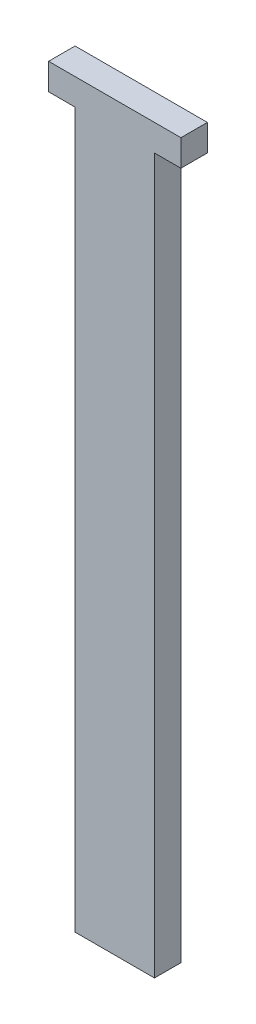
ISO-10303-21;
HEADER;
FILE_DESCRIPTION(('STEP AP214'),'2;1');
FILE_NAME('part.step','',(''),(''),'','','');
FILE_SCHEMA(('AUTOMOTIVE_DESIGN { 1 0 10303 214 1 1 1 1 }'));
ENDSEC;
DATA;
#1=APPLICATION_CONTEXT('core data for automotive mechanical design processes');
#2=APPLICATION_PROTOCOL_DEFINITION('international standard','automotive_design',2000,#1);
#3=PRODUCT_CONTEXT('',#1,'mechanical');
#4=PRODUCT('Part','Part','',(#3));
#5=PRODUCT_RELATED_PRODUCT_CATEGORY('part','',(#4));
#6=PRODUCT_DEFINITION_FORMATION('','',#4);
#7=PRODUCT_DEFINITION_CONTEXT('part definition',#1,'design');
#8=PRODUCT_DEFINITION('design','',#6,#7);
#9=PRODUCT_DEFINITION_SHAPE('','',#8);
#10=(LENGTH_UNIT() NAMED_UNIT(*) SI_UNIT(.MILLI.,.METRE.));
#11=(NAMED_UNIT(*) PLANE_ANGLE_UNIT() SI_UNIT($,.RADIAN.));
#12=(NAMED_UNIT(*) SI_UNIT($,.STERADIAN.) SOLID_ANGLE_UNIT());
#13=UNCERTAINTY_MEASURE_WITH_UNIT(LENGTH_MEASURE(1.E-05),#10,'distance_accuracy_value','');
#14=(GEOMETRIC_REPRESENTATION_CONTEXT(3) GLOBAL_UNCERTAINTY_ASSIGNED_CONTEXT((#13)) GLOBAL_UNIT_ASSIGNED_CONTEXT((#10,
#11,#12)) REPRESENTATION_CONTEXT('',''));
#15=CARTESIAN_POINT('',(0.,0.,0.));
#16=DIRECTION('',(0.,0.,1.));
#17=DIRECTION('',(1.,0.,0.));
#18=AXIS2_PLACEMENT_3D('',#15,#16,#17);
#19=CARTESIAN_POINT('',(-32.5192307692308,47.7884615384615,5.));
#20=DIRECTION('',(0.,1.,0.));
#21=DIRECTION('',(0.,0.,1.));
#22=AXIS2_PLACEMENT_3D('',#19,#20,#21);
#23=PLANE('',#22);
#24=DIRECTION('',(1.,0.,0.));
#25=VECTOR('',#24,1.);
#26=CARTESIAN_POINT('',(-32.5192307692308,47.7884615384615,0.));
#27=LINE('',#26,#25);
#28=CARTESIAN_POINT('',(-32.5192307692308,47.7884615384615,0.));
#29=VERTEX_POINT('',#28);
#30=CARTESIAN_POINT('',(-27.5192307692308,47.7884615384615,0.));
#31=VERTEX_POINT('',#30);
#32=EDGE_CURVE('E131',#29,#31,#27,.T.);
#33=ORIENTED_EDGE('',*,*,#32,.T.);
#34=DIRECTION('',(0.,0.,-1.));
#35=VECTOR('',#34,1.);
#36=CARTESIAN_POINT('',(-27.5192307692308,47.7884615384615,5.));
#37=LINE('',#36,#35);
#38=CARTESIAN_POINT('',(-27.5192307692308,47.7884615384615,5.));
#39=VERTEX_POINT('',#38);
#40=EDGE_CURVE('E11',#39,#31,#37,.T.);
#41=ORIENTED_EDGE('',*,*,#40,.F.);
#42=DIRECTION('',(1.,0.,0.));
#43=VECTOR('',#42,1.);
#44=CARTESIAN_POINT('',(-32.5192307692308,47.7884615384615,5.));
#45=LINE('',#44,#43);
#46=CARTESIAN_POINT('',(-32.5192307692308,47.7884615384615,5.));
#47=VERTEX_POINT('',#46);
#48=EDGE_CURVE('E145',#47,#39,#45,.T.);
#49=ORIENTED_EDGE('',*,*,#48,.F.);
#50=DIRECTION('',(0.,0.,-1.));
#51=VECTOR('',#50,1.);
#52=CARTESIAN_POINT('',(-32.5192307692308,47.7884615384615,5.));
#53=LINE('',#52,#51);
#54=EDGE_CURVE('E127',#47,#29,#53,.T.);
#55=ORIENTED_EDGE('',*,*,#54,.T.);
#56=EDGE_LOOP('',(#33,#41,#49,#55));
#57=FACE_BOUND('',#56,.T.);
#58=ADVANCED_FACE('F35',(#57),#23,.F.);
#59=CARTESIAN_POINT('',(-27.5192307692308,47.7884615384615,5.));
#60=DIRECTION('',(1.,0.,0.));
#61=DIRECTION('',(0.,1.,0.));
#62=AXIS2_PLACEMENT_3D('',#59,#60,#61);
#63=PLANE('',#62);
#64=DIRECTION('',(0.,-1.,0.));
#65=VECTOR('',#64,1.);
#66=CARTESIAN_POINT('',(-27.5192307692308,47.7884615384615,0.));
#67=LINE('',#66,#65);
#68=CARTESIAN_POINT('',(-27.5192307692307,-87.2115384615385,0.));
#69=VERTEX_POINT('',#68);
#70=EDGE_CURVE('E134',#31,#69,#67,.T.);
#71=ORIENTED_EDGE('',*,*,#70,.T.);
#72=DIRECTION('',(0.,0.,-1.));
#73=VECTOR('',#72,1.);
#74=CARTESIAN_POINT('',(-27.5192307692307,-87.2115384615385,5.));
#75=LINE('',#74,#73);
#76=CARTESIAN_POINT('',(-27.5192307692307,-87.2115384615385,5.));
#77=VERTEX_POINT('',#76);
#78=EDGE_CURVE('E43',#77,#69,#75,.T.);
#79=ORIENTED_EDGE('',*,*,#78,.F.);
#80=DIRECTION('',(0.,-1.,0.));
#81=VECTOR('',#80,1.);
#82=CARTESIAN_POINT('',(-27.5192307692308,47.7884615384615,5.));
#83=LINE('',#82,#81);
#84=EDGE_CURVE('E94',#39,#77,#83,.T.);
#85=ORIENTED_EDGE('',*,*,#84,.F.);
#86=ORIENTED_EDGE('',*,*,#40,.T.);
#87=EDGE_LOOP('',(#71,#79,#85,#86));
#88=FACE_BOUND('',#87,.T.);
#89=ADVANCED_FACE('F180',(#88),#63,.F.);
#90=CARTESIAN_POINT('',(-27.5192307692307,-87.2115384615385,5.));
#91=DIRECTION('',(0.,1.,0.));
#92=DIRECTION('',(0.,0.,1.));
#93=AXIS2_PLACEMENT_3D('',#90,#91,#92);
#94=PLANE('',#93);
#95=DIRECTION('',(1.,0.,0.));
#96=VECTOR('',#95,1.);
#97=CARTESIAN_POINT('',(-27.5192307692307,-87.2115384615385,0.));
#98=LINE('',#97,#96);
#99=CARTESIAN_POINT('',(-12.5192307692308,-87.2115384615385,0.));
#100=VERTEX_POINT('',#99);
#101=EDGE_CURVE('E136',#69,#100,#98,.T.);
#102=ORIENTED_EDGE('',*,*,#101,.T.);
#103=DIRECTION('',(0.,0.,-1.));
#104=VECTOR('',#103,1.);
#105=CARTESIAN_POINT('',(-12.5192307692308,-87.2115384615385,5.));
#106=LINE('',#105,#104);
#107=CARTESIAN_POINT('',(-12.5192307692308,-87.2115384615385,5.));
#108=VERTEX_POINT('',#107);
#109=EDGE_CURVE('E152',#108,#100,#106,.T.);
#110=ORIENTED_EDGE('',*,*,#109,.F.);
#111=DIRECTION('',(1.,0.,0.));
#112=VECTOR('',#111,1.);
#113=CARTESIAN_POINT('',(-27.5192307692307,-87.2115384615385,5.));
#114=LINE('',#113,#112);
#115=EDGE_CURVE('E160',#77,#108,#114,.T.);
#116=ORIENTED_EDGE('',*,*,#115,.F.);
#117=ORIENTED_EDGE('',*,*,#78,.T.);
#118=EDGE_LOOP('',(#102,#110,#116,#117));
#119=FACE_BOUND('',#118,.T.);
#120=ADVANCED_FACE('F158',(#119),#94,.F.);
#121=CARTESIAN_POINT('',(-12.5192307692307,47.7884615384615,5.));
#122=DIRECTION('',(-1.,0.,0.));
#123=DIRECTION('',(0.,-1.,0.));
#124=AXIS2_PLACEMENT_3D('',#121,#122,#123);
#125=PLANE('',#124);
#126=DIRECTION('',(0.,1.,0.));
#127=VECTOR('',#126,1.);
#128=CARTESIAN_POINT('',(-12.5192307692307,47.7884615384615,0.));
#129=LINE('',#128,#127);
#130=CARTESIAN_POINT('',(-12.5192307692307,47.7884615384615,0.));
#131=VERTEX_POINT('',#130);
#132=EDGE_CURVE('E138',#100,#131,#129,.T.);
#133=ORIENTED_EDGE('',*,*,#132,.T.);
#134=DIRECTION('',(0.,0.,-1.));
#135=VECTOR('',#134,1.);
#136=CARTESIAN_POINT('',(-12.5192307692307,47.7884615384615,5.));
#137=LINE('',#136,#135);
#138=CARTESIAN_POINT('',(-12.5192307692307,47.7884615384615,5.));
#139=VERTEX_POINT('',#138);
#140=EDGE_CURVE('E149',#139,#131,#137,.T.);
#141=ORIENTED_EDGE('',*,*,#140,.F.);
#142=DIRECTION('',(0.,1.,0.));
#143=VECTOR('',#142,1.);
#144=CARTESIAN_POINT('',(-12.5192307692307,47.7884615384615,5.));
#145=LINE('',#144,#143);
#146=EDGE_CURVE('E172',#108,#139,#145,.T.);
#147=ORIENTED_EDGE('',*,*,#146,.F.);
#148=ORIENTED_EDGE('',*,*,#109,.T.);
#149=EDGE_LOOP('',(#133,#141,#147,#148));
#150=FACE_BOUND('',#149,.T.);
#151=ADVANCED_FACE('F168',(#150),#125,.F.);
#152=CARTESIAN_POINT('',(-12.5192307692307,47.7884615384615,5.));
#153=DIRECTION('',(0.,1.,0.));
#154=DIRECTION('',(0.,0.,1.));
#155=AXIS2_PLACEMENT_3D('',#152,#153,#154);
#156=PLANE('',#155);
#157=DIRECTION('',(1.,0.,0.));
#158=VECTOR('',#157,1.);
#159=CARTESIAN_POINT('',(-12.5192307692307,47.7884615384615,0.));
#160=LINE('',#159,#158);
#161=CARTESIAN_POINT('',(-7.51923076923075,47.7884615384615,0.));
#162=VERTEX_POINT('',#161);
#163=EDGE_CURVE('E140',#131,#162,#160,.T.);
#164=ORIENTED_EDGE('',*,*,#163,.T.);
#165=DIRECTION('',(0.,0.,-1.));
#166=VECTOR('',#165,1.);
#167=CARTESIAN_POINT('',(-7.51923076923075,47.7884615384615,5.));
#168=LINE('',#167,#166);
#169=CARTESIAN_POINT('',(-7.51923076923075,47.7884615384615,5.));
#170=VERTEX_POINT('',#169);
#171=EDGE_CURVE('E122',#170,#162,#168,.T.);
#172=ORIENTED_EDGE('',*,*,#171,.F.);
#173=DIRECTION('',(1.,0.,0.));
#174=VECTOR('',#173,1.);
#175=CARTESIAN_POINT('',(-12.5192307692307,47.7884615384615,5.));
#176=LINE('',#175,#174);
#177=EDGE_CURVE('E113',#139,#170,#176,.T.);
#178=ORIENTED_EDGE('',*,*,#177,.F.);
#179=ORIENTED_EDGE('',*,*,#140,.T.);
#180=EDGE_LOOP('',(#164,#172,#178,#179));
#181=FACE_BOUND('',#180,.T.);
#182=ADVANCED_FACE('F171',(#181),#156,.F.);
#183=CARTESIAN_POINT('',(-7.51923076923075,52.7884615384615,5.));
#184=DIRECTION('',(-1.,0.,0.));
#185=DIRECTION('',(0.,-1.,0.));
#186=AXIS2_PLACEMENT_3D('',#183,#184,#185);
#187=PLANE('',#186);
#188=DIRECTION('',(0.,1.,0.));
#189=VECTOR('',#188,1.);
#190=CARTESIAN_POINT('',(-7.51923076923075,52.7884615384615,0.));
#191=LINE('',#190,#189);
#192=CARTESIAN_POINT('',(-7.51923076923075,52.7884615384615,0.));
#193=VERTEX_POINT('',#192);
#194=EDGE_CURVE('E121',#162,#193,#191,.T.);
#195=ORIENTED_EDGE('',*,*,#194,.T.);
#196=DIRECTION('',(0.,0.,-1.));
#197=VECTOR('',#196,1.);
#198=CARTESIAN_POINT('',(-7.51923076923075,52.7884615384615,5.));
#199=LINE('',#198,#197);
#200=CARTESIAN_POINT('',(-7.51923076923075,52.7884615384615,5.));
#201=VERTEX_POINT('',#200);
#202=EDGE_CURVE('E118',#201,#193,#199,.T.);
#203=ORIENTED_EDGE('',*,*,#202,.F.);
#204=DIRECTION('',(0.,1.,0.));
#205=VECTOR('',#204,1.);
#206=CARTESIAN_POINT('',(-7.51923076923075,52.7884615384615,5.));
#207=LINE('',#206,#205);
#208=EDGE_CURVE('E107',#170,#201,#207,.T.);
#209=ORIENTED_EDGE('',*,*,#208,.F.);
#210=ORIENTED_EDGE('',*,*,#171,.T.);
#211=EDGE_LOOP('',(#195,#203,#209,#210));
#212=FACE_BOUND('',#211,.T.);
#213=ADVANCED_FACE('F119',(#212),#187,.F.);
#214=CARTESIAN_POINT('',(-32.5192307692308,52.7884615384615,5.));
#215=DIRECTION('',(0.,-1.,0.));
#216=DIRECTION('',(0.,0.,-1.));
#217=AXIS2_PLACEMENT_3D('',#214,#215,#216);
#218=PLANE('',#217);
#219=DIRECTION('',(-1.,0.,0.));
#220=VECTOR('',#219,1.);
#221=CARTESIAN_POINT('',(-32.5192307692308,52.7884615384615,0.));
#222=LINE('',#221,#220);
#223=CARTESIAN_POINT('',(-32.5192307692308,52.7884615384615,0.));
#224=VERTEX_POINT('',#223);
#225=EDGE_CURVE('E80',#193,#224,#222,.T.);
#226=ORIENTED_EDGE('',*,*,#225,.T.);
#227=DIRECTION('',(0.,0.,-1.));
#228=VECTOR('',#227,1.);
#229=CARTESIAN_POINT('',(-32.5192307692308,52.7884615384615,5.));
#230=LINE('',#229,#228);
#231=CARTESIAN_POINT('',(-32.5192307692308,52.7884615384615,5.));
#232=VERTEX_POINT('',#231);
#233=EDGE_CURVE('E123',#232,#224,#230,.T.);
#234=ORIENTED_EDGE('',*,*,#233,.F.);
#235=DIRECTION('',(-1.,0.,0.));
#236=VECTOR('',#235,1.);
#237=CARTESIAN_POINT('',(-32.5192307692308,52.7884615384615,5.));
#238=LINE('',#237,#236);
#239=EDGE_CURVE('E111',#201,#232,#238,.T.);
#240=ORIENTED_EDGE('',*,*,#239,.F.);
#241=ORIENTED_EDGE('',*,*,#202,.T.);
#242=EDGE_LOOP('',(#226,#234,#240,#241));
#243=FACE_BOUND('',#242,.T.);
#244=ADVANCED_FACE('F125',(#243),#218,.F.);
#245=CARTESIAN_POINT('',(-32.5192307692308,52.7884615384615,5.));
#246=DIRECTION('',(1.,0.,0.));
#247=DIRECTION('',(0.,0.,-1.));
#248=AXIS2_PLACEMENT_3D('',#245,#246,#247);
#249=PLANE('',#248);
#250=DIRECTION('',(0.,-1.,0.));
#251=VECTOR('',#250,1.);
#252=CARTESIAN_POINT('',(-32.5192307692308,52.7884615384615,0.));
#253=LINE('',#252,#251);
#254=EDGE_CURVE('E86',#224,#29,#253,.T.);
#255=ORIENTED_EDGE('',*,*,#254,.T.);
#256=ORIENTED_EDGE('',*,*,#54,.F.);
#257=DIRECTION('',(0.,-1.,0.));
#258=VECTOR('',#257,1.);
#259=CARTESIAN_POINT('',(-32.5192307692308,52.7884615384615,5.));
#260=LINE('',#259,#258);
#261=EDGE_CURVE('E51',#232,#47,#260,.T.);
#262=ORIENTED_EDGE('',*,*,#261,.F.);
#263=ORIENTED_EDGE('',*,*,#233,.T.);
#264=EDGE_LOOP('',(#255,#256,#262,#263));
#265=FACE_BOUND('',#264,.T.);
#266=ADVANCED_FACE('F196',(#265),#249,.F.);
#267=CARTESIAN_POINT('',(0.,0.,5.));
#268=DIRECTION('',(0.,0.,-1.));
#269=DIRECTION('',(-1.,0.,0.));
#270=AXIS2_PLACEMENT_3D('',#267,#268,#269);
#271=PLANE('',#270);
#272=ORIENTED_EDGE('',*,*,#48,.T.);
#273=ORIENTED_EDGE('',*,*,#84,.T.);
#274=ORIENTED_EDGE('',*,*,#115,.T.);
#275=ORIENTED_EDGE('',*,*,#146,.T.);
#276=ORIENTED_EDGE('',*,*,#177,.T.);
#277=ORIENTED_EDGE('',*,*,#208,.T.);
#278=ORIENTED_EDGE('',*,*,#239,.T.);
#279=ORIENTED_EDGE('',*,*,#261,.T.);
#280=EDGE_LOOP('',(#272,#273,#274,#275,#276,#277,#278,#279));
#281=FACE_BOUND('',#280,.T.);
#282=ADVANCED_FACE('F109',(#281),#271,.F.);
#283=CARTESIAN_POINT('',(0.,0.,0.));
#284=DIRECTION('',(0.,0.,-1.));
#285=DIRECTION('',(-1.,0.,0.));
#286=AXIS2_PLACEMENT_3D('',#283,#284,#285);
#287=PLANE('',#286);
#288=ORIENTED_EDGE('',*,*,#32,.F.);
#289=ORIENTED_EDGE('',*,*,#254,.F.);
#290=ORIENTED_EDGE('',*,*,#225,.F.);
#291=ORIENTED_EDGE('',*,*,#194,.F.);
#292=ORIENTED_EDGE('',*,*,#163,.F.);
#293=ORIENTED_EDGE('',*,*,#132,.F.);
#294=ORIENTED_EDGE('',*,*,#101,.F.);
#295=ORIENTED_EDGE('',*,*,#70,.F.);
#296=EDGE_LOOP('',(#288,#289,#290,#291,#292,#293,#294,#295));
#297=FACE_BOUND('',#296,.T.);
#298=ADVANCED_FACE('F164',(#297),#287,.T.);
#299=CLOSED_SHELL('',(#58,#89,#120,#151,#182,#213,#244,#266,#282,#298));
#300=MANIFOLD_SOLID_BREP('B2',#299);
#301=ADVANCED_BREP_SHAPE_REPRESENTATION('',(#18,#300),#14);
#302=SHAPE_DEFINITION_REPRESENTATION(#9,#301);
ENDSEC;
END-ISO-10303-21;
